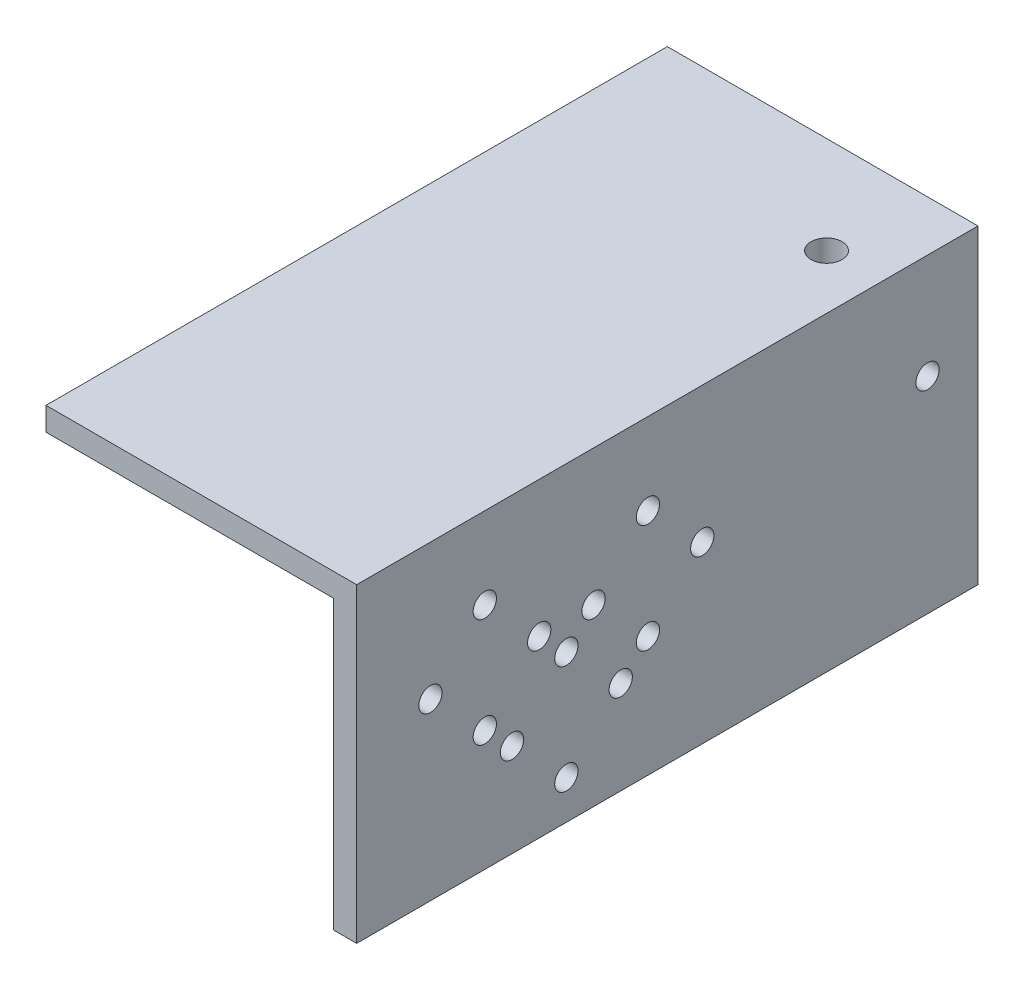
ISO-10303-21;
HEADER;
FILE_DESCRIPTION(('STEP AP214'),'2;1');
FILE_NAME('part.step','',(''),(''),'','','');
FILE_SCHEMA(('AUTOMOTIVE_DESIGN { 1 0 10303 214 1 1 1 1 }'));
ENDSEC;
DATA;
#1=APPLICATION_CONTEXT('core data for automotive mechanical design processes');
#2=APPLICATION_PROTOCOL_DEFINITION('international standard','automotive_design',2000,#1);
#3=PRODUCT_CONTEXT('',#1,'mechanical');
#4=PRODUCT('Part','Part','',(#3));
#5=PRODUCT_RELATED_PRODUCT_CATEGORY('part','',(#4));
#6=PRODUCT_DEFINITION_FORMATION('','',#4);
#7=PRODUCT_DEFINITION_CONTEXT('part definition',#1,'design');
#8=PRODUCT_DEFINITION('design','',#6,#7);
#9=PRODUCT_DEFINITION_SHAPE('','',#8);
#10=(LENGTH_UNIT() NAMED_UNIT(*) SI_UNIT(.MILLI.,.METRE.));
#11=(NAMED_UNIT(*) PLANE_ANGLE_UNIT() SI_UNIT($,.RADIAN.));
#12=(NAMED_UNIT(*) SI_UNIT($,.STERADIAN.) SOLID_ANGLE_UNIT());
#13=UNCERTAINTY_MEASURE_WITH_UNIT(LENGTH_MEASURE(1.E-05),#10,'distance_accuracy_value','');
#14=(GEOMETRIC_REPRESENTATION_CONTEXT(3) GLOBAL_UNCERTAINTY_ASSIGNED_CONTEXT((#13)) GLOBAL_UNIT_ASSIGNED_CONTEXT((#10,
#11,#12)) REPRESENTATION_CONTEXT('',''));
#15=CARTESIAN_POINT('',(0.,0.,0.));
#16=DIRECTION('',(0.,0.,1.));
#17=DIRECTION('',(1.,0.,0.));
#18=AXIS2_PLACEMENT_3D('',#15,#16,#17);
#19=CARTESIAN_POINT('',(0.,0.,-80.));
#20=DIRECTION('',(-1.,0.,0.));
#21=DIRECTION('',(0.,-1.,0.));
#22=AXIS2_PLACEMENT_3D('',#19,#20,#21);
#23=PLANE('',#22);
#24=DIRECTION('',(0.,-1.,0.));
#25=VECTOR('',#24,1.);
#26=CARTESIAN_POINT('',(0.,0.,-80.));
#27=LINE('',#26,#25);
#28=CARTESIAN_POINT('',(0.,0.,-80.));
#29=VERTEX_POINT('',#28);
#30=CARTESIAN_POINT('',(0.,-3.,-80.));
#31=VERTEX_POINT('',#30);
#32=EDGE_CURVE('E109',#29,#31,#27,.T.);
#33=ORIENTED_EDGE('',*,*,#32,.T.);
#34=DIRECTION('',(0.,0.,1.));
#35=VECTOR('',#34,1.);
#36=CARTESIAN_POINT('',(0.,-3.,-80.));
#37=LINE('',#36,#35);
#38=CARTESIAN_POINT('',(0.,-3.,0.));
#39=VERTEX_POINT('',#38);
#40=EDGE_CURVE('E100',#31,#39,#37,.T.);
#41=ORIENTED_EDGE('',*,*,#40,.T.);
#42=DIRECTION('',(0.,-1.,0.));
#43=VECTOR('',#42,1.);
#44=CARTESIAN_POINT('',(0.,0.,0.));
#45=LINE('',#44,#43);
#46=CARTESIAN_POINT('',(0.,0.,0.));
#47=VERTEX_POINT('',#46);
#48=EDGE_CURVE('E107',#47,#39,#45,.T.);
#49=ORIENTED_EDGE('',*,*,#48,.F.);
#50=DIRECTION('',(0.,0.,1.));
#51=VECTOR('',#50,1.);
#52=CARTESIAN_POINT('',(0.,0.,-80.));
#53=LINE('',#52,#51);
#54=EDGE_CURVE('E11',#29,#47,#53,.T.);
#55=ORIENTED_EDGE('',*,*,#54,.F.);
#56=EDGE_LOOP('',(#33,#41,#49,#55));
#57=FACE_BOUND('',#56,.T.);
#58=ADVANCED_FACE('F35',(#57),#23,.T.);
#59=CARTESIAN_POINT('',(0.,0.,-80.));
#60=DIRECTION('',(0.,1.,0.));
#61=DIRECTION('',(0.,0.,1.));
#62=AXIS2_PLACEMENT_3D('',#59,#60,#61);
#63=PLANE('',#62);
#64=CARTESIAN_POINT('',(33.,0.,-67.5));
#65=DIRECTION('',(0.,1.,0.));
#66=DIRECTION('',(0.,0.,1.));
#67=AXIS2_PLACEMENT_3D('',#64,#65,#66);
#68=CIRCLE('',#67,2.);
#69=CARTESIAN_POINT('',(33.,0.,-65.5));
#70=VERTEX_POINT('',#69);
#71=EDGE_CURVE('E186',#70,#70,#68,.T.);
#72=ORIENTED_EDGE('',*,*,#71,.F.);
#73=EDGE_LOOP('',(#72));
#74=FACE_BOUND('',#73,.T.);
#75=DIRECTION('',(-1.,0.,0.));
#76=VECTOR('',#75,1.);
#77=CARTESIAN_POINT('',(0.,0.,0.));
#78=LINE('',#77,#76);
#79=CARTESIAN_POINT('',(40.,0.,0.));
#80=VERTEX_POINT('',#79);
#81=EDGE_CURVE('E113',#80,#47,#78,.T.);
#82=ORIENTED_EDGE('',*,*,#81,.F.);
#83=DIRECTION('',(0.,0.,1.));
#84=VECTOR('',#83,1.);
#85=CARTESIAN_POINT('',(40.,0.,-80.));
#86=LINE('',#85,#84);
#87=CARTESIAN_POINT('',(40.,0.,-80.));
#88=VERTEX_POINT('',#87);
#89=EDGE_CURVE('E43',#88,#80,#86,.T.);
#90=ORIENTED_EDGE('',*,*,#89,.F.);
#91=DIRECTION('',(-1.,0.,0.));
#92=VECTOR('',#91,1.);
#93=CARTESIAN_POINT('',(0.,0.,-80.));
#94=LINE('',#93,#92);
#95=EDGE_CURVE('E119',#88,#29,#94,.T.);
#96=ORIENTED_EDGE('',*,*,#95,.T.);
#97=ORIENTED_EDGE('',*,*,#54,.T.);
#98=EDGE_LOOP('',(#82,#90,#96,#97));
#99=FACE_BOUND('',#98,.T.);
#100=ADVANCED_FACE('F225',(#74,#99),#63,.T.);
#101=CARTESIAN_POINT('',(40.,0.,-80.));
#102=DIRECTION('',(1.,0.,0.));
#103=DIRECTION('',(0.,1.,0.));
#104=AXIS2_PLACEMENT_3D('',#101,#102,#103);
#105=PLANE('',#104);
#106=CARTESIAN_POINT('',(40.,-10.5,-37.5));
#107=DIRECTION('',(1.,0.,0.));
#108=DIRECTION('',(0.,-1.,0.));
#109=AXIS2_PLACEMENT_3D('',#106,#107,#108);
#110=CIRCLE('',#109,1.5);
#111=CARTESIAN_POINT('',(40.,-12.,-37.5));
#112=VERTEX_POINT('',#111);
#113=EDGE_CURVE('E176',#112,#112,#110,.T.);
#114=ORIENTED_EDGE('',*,*,#113,.F.);
#115=EDGE_LOOP('',(#114));
#116=FACE_BOUND('',#115,.T.);
#117=CARTESIAN_POINT('',(40.,-17.5,-30.5));
#118=DIRECTION('',(1.,0.,0.));
#119=DIRECTION('',(0.,-1.,0.));
#120=AXIS2_PLACEMENT_3D('',#117,#118,#119);
#121=CIRCLE('',#120,1.5);
#122=CARTESIAN_POINT('',(40.,-19.,-30.5));
#123=VERTEX_POINT('',#122);
#124=EDGE_CURVE('E173',#123,#123,#121,.T.);
#125=ORIENTED_EDGE('',*,*,#124,.F.);
#126=EDGE_LOOP('',(#125));
#127=FACE_BOUND('',#126,.T.);
#128=CARTESIAN_POINT('',(40.,-24.5,-37.5));
#129=DIRECTION('',(1.,0.,0.));
#130=DIRECTION('',(0.,-1.,0.));
#131=AXIS2_PLACEMENT_3D('',#128,#129,#130);
#132=CIRCLE('',#131,1.5);
#133=CARTESIAN_POINT('',(40.,-26.,-37.5));
#134=VERTEX_POINT('',#133);
#135=EDGE_CURVE('E170',#134,#134,#132,.T.);
#136=ORIENTED_EDGE('',*,*,#135,.F.);
#137=EDGE_LOOP('',(#136));
#138=FACE_BOUND('',#137,.T.);
#139=CARTESIAN_POINT('',(40.,-17.5,-9.5));
#140=DIRECTION('',(1.,0.,0.));
#141=DIRECTION('',(0.,1.,0.));
#142=AXIS2_PLACEMENT_3D('',#139,#140,#141);
#143=CIRCLE('',#142,1.5);
#144=CARTESIAN_POINT('',(40.,-16.,-9.5));
#145=VERTEX_POINT('',#144);
#146=EDGE_CURVE('E166',#145,#145,#143,.T.);
#147=ORIENTED_EDGE('',*,*,#146,.F.);
#148=EDGE_LOOP('',(#147));
#149=FACE_BOUND('',#148,.T.);
#150=CARTESIAN_POINT('',(40.,-24.5,-16.5));
#151=DIRECTION('',(1.,0.,0.));
#152=DIRECTION('',(0.,1.,0.));
#153=AXIS2_PLACEMENT_3D('',#150,#151,#152);
#154=CIRCLE('',#153,1.5);
#155=CARTESIAN_POINT('',(40.,-23.,-16.5));
#156=VERTEX_POINT('',#155);
#157=EDGE_CURVE('E162',#156,#156,#154,.T.);
#158=ORIENTED_EDGE('',*,*,#157,.F.);
#159=EDGE_LOOP('',(#158));
#160=FACE_BOUND('',#159,.T.);
#161=CARTESIAN_POINT('',(40.,-17.5,-23.5));
#162=DIRECTION('',(1.,0.,0.));
#163=DIRECTION('',(0.,1.,0.));
#164=AXIS2_PLACEMENT_3D('',#161,#162,#163);
#165=CIRCLE('',#164,1.5);
#166=CARTESIAN_POINT('',(40.,-16.,-23.5));
#167=VERTEX_POINT('',#166);
#168=EDGE_CURVE('E158',#167,#167,#165,.T.);
#169=ORIENTED_EDGE('',*,*,#168,.F.);
#170=EDGE_LOOP('',(#169));
#171=FACE_BOUND('',#170,.T.);
#172=CARTESIAN_POINT('',(40.,-10.5,-16.5));
#173=DIRECTION('',(1.,0.,0.));
#174=DIRECTION('',(0.,1.,0.));
#175=AXIS2_PLACEMENT_3D('',#172,#173,#174);
#176=CIRCLE('',#175,1.5);
#177=CARTESIAN_POINT('',(40.,-9.,-16.5));
#178=VERTEX_POINT('',#177);
#179=EDGE_CURVE('E154',#178,#178,#176,.T.);
#180=ORIENTED_EDGE('',*,*,#179,.F.);
#181=EDGE_LOOP('',(#180));
#182=FACE_BOUND('',#181,.T.);
#183=CARTESIAN_POINT('',(40.,-28.,-20.));
#184=DIRECTION('',(1.,0.,0.));
#185=DIRECTION('',(0.,1.,0.));
#186=AXIS2_PLACEMENT_3D('',#183,#184,#185);
#187=CIRCLE('',#186,1.5);
#188=CARTESIAN_POINT('',(40.,-26.5,-20.));
#189=VERTEX_POINT('',#188);
#190=EDGE_CURVE('E150',#189,#189,#187,.T.);
#191=ORIENTED_EDGE('',*,*,#190,.F.);
#192=EDGE_LOOP('',(#191));
#193=FACE_BOUND('',#192,.T.);
#194=CARTESIAN_POINT('',(40.,-35.,-27.));
#195=DIRECTION('',(1.,0.,0.));
#196=DIRECTION('',(0.,1.,0.));
#197=AXIS2_PLACEMENT_3D('',#194,#195,#196);
#198=CIRCLE('',#197,1.5);
#199=CARTESIAN_POINT('',(40.,-33.5,-27.));
#200=VERTEX_POINT('',#199);
#201=EDGE_CURVE('E146',#200,#200,#198,.T.);
#202=ORIENTED_EDGE('',*,*,#201,.F.);
#203=EDGE_LOOP('',(#202));
#204=FACE_BOUND('',#203,.T.);
#205=CARTESIAN_POINT('',(40.,-28.,-34.));
#206=DIRECTION('',(1.,0.,0.));
#207=DIRECTION('',(0.,1.,0.));
#208=AXIS2_PLACEMENT_3D('',#205,#206,#207);
#209=CIRCLE('',#208,1.5);
#210=CARTESIAN_POINT('',(40.,-26.5,-34.));
#211=VERTEX_POINT('',#210);
#212=EDGE_CURVE('E142',#211,#211,#209,.T.);
#213=ORIENTED_EDGE('',*,*,#212,.F.);
#214=EDGE_LOOP('',(#213));
#215=FACE_BOUND('',#214,.T.);
#216=CARTESIAN_POINT('',(40.,-21.,-27.));
#217=DIRECTION('',(1.,0.,0.));
#218=DIRECTION('',(0.,1.,0.));
#219=AXIS2_PLACEMENT_3D('',#216,#217,#218);
#220=CIRCLE('',#219,1.5);
#221=CARTESIAN_POINT('',(40.,-19.5,-27.));
#222=VERTEX_POINT('',#221);
#223=EDGE_CURVE('E138',#222,#222,#220,.T.);
#224=ORIENTED_EDGE('',*,*,#223,.F.);
#225=EDGE_LOOP('',(#224));
#226=FACE_BOUND('',#225,.T.);
#227=CARTESIAN_POINT('',(40.,-13.5,-73.5));
#228=DIRECTION('',(1.,0.,0.));
#229=DIRECTION('',(0.,1.,0.));
#230=AXIS2_PLACEMENT_3D('',#227,#228,#229);
#231=CIRCLE('',#230,1.5);
#232=CARTESIAN_POINT('',(40.,-12.,-73.5));
#233=VERTEX_POINT('',#232);
#234=EDGE_CURVE('E134',#233,#233,#231,.T.);
#235=ORIENTED_EDGE('',*,*,#234,.F.);
#236=EDGE_LOOP('',(#235));
#237=FACE_BOUND('',#236,.T.);
#238=CARTESIAN_POINT('',(40.,-17.5,-44.5));
#239=DIRECTION('',(1.,0.,0.));
#240=DIRECTION('',(0.,-1.,0.));
#241=AXIS2_PLACEMENT_3D('',#238,#239,#240);
#242=CIRCLE('',#241,1.5);
#243=CARTESIAN_POINT('',(40.,-19.,-44.5));
#244=VERTEX_POINT('',#243);
#245=EDGE_CURVE('E130',#244,#244,#242,.T.);
#246=ORIENTED_EDGE('',*,*,#245,.F.);
#247=EDGE_LOOP('',(#246));
#248=FACE_BOUND('',#247,.T.);
#249=DIRECTION('',(0.,1.,0.));
#250=VECTOR('',#249,1.);
#251=CARTESIAN_POINT('',(40.,0.,0.));
#252=LINE('',#251,#250);
#253=CARTESIAN_POINT('',(40.,-40.,0.));
#254=VERTEX_POINT('',#253);
#255=EDGE_CURVE('E116',#254,#80,#252,.T.);
#256=ORIENTED_EDGE('',*,*,#255,.F.);
#257=DIRECTION('',(0.,0.,1.));
#258=VECTOR('',#257,1.);
#259=CARTESIAN_POINT('',(40.,-40.,-80.));
#260=LINE('',#259,#258);
#261=CARTESIAN_POINT('',(40.,-40.,-80.));
#262=VERTEX_POINT('',#261);
#263=EDGE_CURVE('E125',#262,#254,#260,.T.);
#264=ORIENTED_EDGE('',*,*,#263,.F.);
#265=DIRECTION('',(0.,1.,0.));
#266=VECTOR('',#265,1.);
#267=CARTESIAN_POINT('',(40.,0.,-80.));
#268=LINE('',#267,#266);
#269=EDGE_CURVE('E220',#262,#88,#268,.T.);
#270=ORIENTED_EDGE('',*,*,#269,.T.);
#271=ORIENTED_EDGE('',*,*,#89,.T.);
#272=EDGE_LOOP('',(#256,#264,#270,#271));
#273=FACE_BOUND('',#272,.T.);
#274=ADVANCED_FACE('F232',(#116,#127,#138,#149,#160,#171,#182,#193,#204,#215,#226,#237,#248,
#273),#105,.T.);
#275=CARTESIAN_POINT('',(0.,-40.,-80.));
#276=DIRECTION('',(0.,-1.,0.));
#277=DIRECTION('',(0.,0.,-1.));
#278=AXIS2_PLACEMENT_3D('',#275,#276,#277);
#279=PLANE('',#278);
#280=DIRECTION('',(0.,0.,1.));
#281=VECTOR('',#280,1.);
#282=CARTESIAN_POINT('',(37.,-40.,-80.));
#283=LINE('',#282,#281);
#284=CARTESIAN_POINT('',(37.,-40.,-80.));
#285=VERTEX_POINT('',#284);
#286=CARTESIAN_POINT('',(37.,-40.,0.));
#287=VERTEX_POINT('',#286);
#288=EDGE_CURVE('E211',#285,#287,#283,.T.);
#289=ORIENTED_EDGE('',*,*,#288,.F.);
#290=DIRECTION('',(1.,0.,0.));
#291=VECTOR('',#290,1.);
#292=CARTESIAN_POINT('',(0.,-40.,-80.));
#293=LINE('',#292,#291);
#294=EDGE_CURVE('E80',#285,#262,#293,.T.);
#295=ORIENTED_EDGE('',*,*,#294,.T.);
#296=ORIENTED_EDGE('',*,*,#263,.T.);
#297=DIRECTION('',(1.,0.,0.));
#298=VECTOR('',#297,1.);
#299=CARTESIAN_POINT('',(0.,-40.,0.));
#300=LINE('',#299,#298);
#301=EDGE_CURVE('E114',#287,#254,#300,.T.);
#302=ORIENTED_EDGE('',*,*,#301,.F.);
#303=EDGE_LOOP('',(#289,#295,#296,#302));
#304=FACE_BOUND('',#303,.T.);
#305=ADVANCED_FACE('F230',(#304),#279,.T.);
#306=CARTESIAN_POINT('',(0.,0.,-80.));
#307=DIRECTION('',(0.,0.,1.));
#308=DIRECTION('',(1.,0.,0.));
#309=AXIS2_PLACEMENT_3D('',#306,#307,#308);
#310=PLANE('',#309);
#311=DIRECTION('',(0.,1.,0.));
#312=VECTOR('',#311,1.);
#313=CARTESIAN_POINT('',(37.,0.,-80.));
#314=LINE('',#313,#312);
#315=CARTESIAN_POINT('',(37.,-3.,-80.));
#316=VERTEX_POINT('',#315);
#317=EDGE_CURVE('E105',#285,#316,#314,.T.);
#318=ORIENTED_EDGE('',*,*,#317,.T.);
#319=DIRECTION('',(-1.,0.,0.));
#320=VECTOR('',#319,1.);
#321=CARTESIAN_POINT('',(0.,-3.,-80.));
#322=LINE('',#321,#320);
#323=EDGE_CURVE('E213',#316,#31,#322,.T.);
#324=ORIENTED_EDGE('',*,*,#323,.T.);
#325=ORIENTED_EDGE('',*,*,#32,.F.);
#326=ORIENTED_EDGE('',*,*,#95,.F.);
#327=ORIENTED_EDGE('',*,*,#269,.F.);
#328=ORIENTED_EDGE('',*,*,#294,.F.);
#329=EDGE_LOOP('',(#318,#324,#325,#326,#327,#328));
#330=FACE_BOUND('',#329,.T.);
#331=ADVANCED_FACE('F227',(#330),#310,.F.);
#332=CARTESIAN_POINT('',(0.,0.,0.));
#333=DIRECTION('',(0.,0.,1.));
#334=DIRECTION('',(1.,0.,0.));
#335=AXIS2_PLACEMENT_3D('',#332,#333,#334);
#336=PLANE('',#335);
#337=DIRECTION('',(0.,1.,0.));
#338=VECTOR('',#337,1.);
#339=CARTESIAN_POINT('',(37.,0.,0.));
#340=LINE('',#339,#338);
#341=CARTESIAN_POINT('',(37.,-3.,0.));
#342=VERTEX_POINT('',#341);
#343=EDGE_CURVE('E51',#287,#342,#340,.T.);
#344=ORIENTED_EDGE('',*,*,#343,.F.);
#345=ORIENTED_EDGE('',*,*,#301,.T.);
#346=ORIENTED_EDGE('',*,*,#255,.T.);
#347=ORIENTED_EDGE('',*,*,#81,.T.);
#348=ORIENTED_EDGE('',*,*,#48,.T.);
#349=DIRECTION('',(-1.,0.,0.));
#350=VECTOR('',#349,1.);
#351=CARTESIAN_POINT('',(0.,-3.,0.));
#352=LINE('',#351,#350);
#353=EDGE_CURVE('E96',#342,#39,#352,.T.);
#354=ORIENTED_EDGE('',*,*,#353,.F.);
#355=EDGE_LOOP('',(#344,#345,#346,#347,#348,#354));
#356=FACE_BOUND('',#355,.T.);
#357=ADVANCED_FACE('F111',(#356),#336,.T.);
#358=CARTESIAN_POINT('',(0.,-3.,-80.));
#359=DIRECTION('',(0.,1.,0.));
#360=DIRECTION('',(0.,0.,1.));
#361=AXIS2_PLACEMENT_3D('',#358,#359,#360);
#362=PLANE('',#361);
#363=CARTESIAN_POINT('',(33.,-3.,-67.5));
#364=DIRECTION('',(0.,1.,0.));
#365=DIRECTION('',(0.,0.,1.));
#366=AXIS2_PLACEMENT_3D('',#363,#364,#365);
#367=CIRCLE('',#366,2.);
#368=CARTESIAN_POINT('',(33.,-3.,-65.5));
#369=VERTEX_POINT('',#368);
#370=EDGE_CURVE('E38',#369,#369,#367,.T.);
#371=ORIENTED_EDGE('',*,*,#370,.T.);
#372=EDGE_LOOP('',(#371));
#373=FACE_BOUND('',#372,.T.);
#374=ORIENTED_EDGE('',*,*,#353,.T.);
#375=ORIENTED_EDGE('',*,*,#40,.F.);
#376=ORIENTED_EDGE('',*,*,#323,.F.);
#377=DIRECTION('',(0.,0.,1.));
#378=VECTOR('',#377,1.);
#379=CARTESIAN_POINT('',(37.,-3.,-80.));
#380=LINE('',#379,#378);
#381=EDGE_CURVE('E102',#316,#342,#380,.T.);
#382=ORIENTED_EDGE('',*,*,#381,.T.);
#383=EDGE_LOOP('',(#374,#375,#376,#382));
#384=FACE_BOUND('',#383,.T.);
#385=ADVANCED_FACE('F98',(#373,#384),#362,.F.);
#386=CARTESIAN_POINT('',(37.,0.,-80.));
#387=DIRECTION('',(1.,0.,0.));
#388=DIRECTION('',(0.,1.,0.));
#389=AXIS2_PLACEMENT_3D('',#386,#387,#388);
#390=PLANE('',#389);
#391=CARTESIAN_POINT('',(37.,-10.5,-37.5));
#392=DIRECTION('',(1.,0.,0.));
#393=DIRECTION('',(0.,1.,0.));
#394=AXIS2_PLACEMENT_3D('',#391,#392,#393);
#395=CIRCLE('',#394,1.5);
#396=CARTESIAN_POINT('',(37.,-8.99999999999999,-37.5));
#397=VERTEX_POINT('',#396);
#398=EDGE_CURVE('E174',#397,#397,#395,.T.);
#399=ORIENTED_EDGE('',*,*,#398,.T.);
#400=EDGE_LOOP('',(#399));
#401=FACE_BOUND('',#400,.T.);
#402=CARTESIAN_POINT('',(37.,-17.5,-30.5));
#403=DIRECTION('',(1.,0.,0.));
#404=DIRECTION('',(0.,1.,0.));
#405=AXIS2_PLACEMENT_3D('',#402,#403,#404);
#406=CIRCLE('',#405,1.5);
#407=CARTESIAN_POINT('',(37.,-16.,-30.5));
#408=VERTEX_POINT('',#407);
#409=EDGE_CURVE('E171',#408,#408,#406,.T.);
#410=ORIENTED_EDGE('',*,*,#409,.T.);
#411=EDGE_LOOP('',(#410));
#412=FACE_BOUND('',#411,.T.);
#413=CARTESIAN_POINT('',(37.,-24.5,-37.5));
#414=DIRECTION('',(1.,0.,0.));
#415=DIRECTION('',(0.,1.,0.));
#416=AXIS2_PLACEMENT_3D('',#413,#414,#415);
#417=CIRCLE('',#416,1.5);
#418=CARTESIAN_POINT('',(37.,-23.,-37.5));
#419=VERTEX_POINT('',#418);
#420=EDGE_CURVE('E167',#419,#419,#417,.T.);
#421=ORIENTED_EDGE('',*,*,#420,.T.);
#422=EDGE_LOOP('',(#421));
#423=FACE_BOUND('',#422,.T.);
#424=CARTESIAN_POINT('',(37.,-17.5,-9.5));
#425=DIRECTION('',(1.,0.,0.));
#426=DIRECTION('',(0.,1.,0.));
#427=AXIS2_PLACEMENT_3D('',#424,#425,#426);
#428=CIRCLE('',#427,1.5);
#429=CARTESIAN_POINT('',(37.,-16.,-9.5));
#430=VERTEX_POINT('',#429);
#431=EDGE_CURVE('E163',#430,#430,#428,.T.);
#432=ORIENTED_EDGE('',*,*,#431,.T.);
#433=EDGE_LOOP('',(#432));
#434=FACE_BOUND('',#433,.T.);
#435=CARTESIAN_POINT('',(37.,-24.5,-16.5));
#436=DIRECTION('',(1.,0.,0.));
#437=DIRECTION('',(0.,1.,0.));
#438=AXIS2_PLACEMENT_3D('',#435,#436,#437);
#439=CIRCLE('',#438,1.5);
#440=CARTESIAN_POINT('',(37.,-23.,-16.5));
#441=VERTEX_POINT('',#440);
#442=EDGE_CURVE('E159',#441,#441,#439,.T.);
#443=ORIENTED_EDGE('',*,*,#442,.T.);
#444=EDGE_LOOP('',(#443));
#445=FACE_BOUND('',#444,.T.);
#446=CARTESIAN_POINT('',(37.,-17.5,-23.5));
#447=DIRECTION('',(1.,0.,0.));
#448=DIRECTION('',(0.,1.,0.));
#449=AXIS2_PLACEMENT_3D('',#446,#447,#448);
#450=CIRCLE('',#449,1.5);
#451=CARTESIAN_POINT('',(37.,-16.,-23.5));
#452=VERTEX_POINT('',#451);
#453=EDGE_CURVE('E155',#452,#452,#450,.T.);
#454=ORIENTED_EDGE('',*,*,#453,.T.);
#455=EDGE_LOOP('',(#454));
#456=FACE_BOUND('',#455,.T.);
#457=CARTESIAN_POINT('',(37.,-10.5,-16.5));
#458=DIRECTION('',(1.,0.,0.));
#459=DIRECTION('',(0.,1.,0.));
#460=AXIS2_PLACEMENT_3D('',#457,#458,#459);
#461=CIRCLE('',#460,1.5);
#462=CARTESIAN_POINT('',(37.,-9.,-16.5));
#463=VERTEX_POINT('',#462);
#464=EDGE_CURVE('E151',#463,#463,#461,.T.);
#465=ORIENTED_EDGE('',*,*,#464,.T.);
#466=EDGE_LOOP('',(#465));
#467=FACE_BOUND('',#466,.T.);
#468=CARTESIAN_POINT('',(37.,-28.,-20.));
#469=DIRECTION('',(1.,0.,0.));
#470=DIRECTION('',(0.,1.,0.));
#471=AXIS2_PLACEMENT_3D('',#468,#469,#470);
#472=CIRCLE('',#471,1.5);
#473=CARTESIAN_POINT('',(37.,-26.5,-20.));
#474=VERTEX_POINT('',#473);
#475=EDGE_CURVE('E147',#474,#474,#472,.T.);
#476=ORIENTED_EDGE('',*,*,#475,.T.);
#477=EDGE_LOOP('',(#476));
#478=FACE_BOUND('',#477,.T.);
#479=CARTESIAN_POINT('',(37.,-35.,-27.));
#480=DIRECTION('',(1.,0.,0.));
#481=DIRECTION('',(0.,1.,0.));
#482=AXIS2_PLACEMENT_3D('',#479,#480,#481);
#483=CIRCLE('',#482,1.5);
#484=CARTESIAN_POINT('',(37.,-33.5,-27.));
#485=VERTEX_POINT('',#484);
#486=EDGE_CURVE('E143',#485,#485,#483,.T.);
#487=ORIENTED_EDGE('',*,*,#486,.T.);
#488=EDGE_LOOP('',(#487));
#489=FACE_BOUND('',#488,.T.);
#490=CARTESIAN_POINT('',(37.,-28.,-34.));
#491=DIRECTION('',(1.,0.,0.));
#492=DIRECTION('',(0.,1.,0.));
#493=AXIS2_PLACEMENT_3D('',#490,#491,#492);
#494=CIRCLE('',#493,1.5);
#495=CARTESIAN_POINT('',(37.,-26.5,-34.));
#496=VERTEX_POINT('',#495);
#497=EDGE_CURVE('E139',#496,#496,#494,.T.);
#498=ORIENTED_EDGE('',*,*,#497,.T.);
#499=EDGE_LOOP('',(#498));
#500=FACE_BOUND('',#499,.T.);
#501=CARTESIAN_POINT('',(37.,-21.,-27.));
#502=DIRECTION('',(1.,0.,0.));
#503=DIRECTION('',(0.,1.,0.));
#504=AXIS2_PLACEMENT_3D('',#501,#502,#503);
#505=CIRCLE('',#504,1.5);
#506=CARTESIAN_POINT('',(37.,-19.5,-27.));
#507=VERTEX_POINT('',#506);
#508=EDGE_CURVE('E135',#507,#507,#505,.T.);
#509=ORIENTED_EDGE('',*,*,#508,.T.);
#510=EDGE_LOOP('',(#509));
#511=FACE_BOUND('',#510,.T.);
#512=CARTESIAN_POINT('',(37.,-13.5,-73.5));
#513=DIRECTION('',(1.,0.,0.));
#514=DIRECTION('',(0.,1.,0.));
#515=AXIS2_PLACEMENT_3D('',#512,#513,#514);
#516=CIRCLE('',#515,1.5);
#517=CARTESIAN_POINT('',(37.,-12.,-73.5));
#518=VERTEX_POINT('',#517);
#519=EDGE_CURVE('E131',#518,#518,#516,.T.);
#520=ORIENTED_EDGE('',*,*,#519,.T.);
#521=EDGE_LOOP('',(#520));
#522=FACE_BOUND('',#521,.T.);
#523=CARTESIAN_POINT('',(37.,-17.5,-44.5));
#524=DIRECTION('',(1.,0.,0.));
#525=DIRECTION('',(0.,1.,0.));
#526=AXIS2_PLACEMENT_3D('',#523,#524,#525);
#527=CIRCLE('',#526,1.5);
#528=CARTESIAN_POINT('',(37.,-16.,-44.5));
#529=VERTEX_POINT('',#528);
#530=EDGE_CURVE('E127',#529,#529,#527,.T.);
#531=ORIENTED_EDGE('',*,*,#530,.T.);
#532=EDGE_LOOP('',(#531));
#533=FACE_BOUND('',#532,.T.);
#534=ORIENTED_EDGE('',*,*,#343,.T.);
#535=ORIENTED_EDGE('',*,*,#381,.F.);
#536=ORIENTED_EDGE('',*,*,#317,.F.);
#537=ORIENTED_EDGE('',*,*,#288,.T.);
#538=EDGE_LOOP('',(#534,#535,#536,#537));
#539=FACE_BOUND('',#538,.T.);
#540=ADVANCED_FACE('F228',(#401,#412,#423,#434,#445,#456,#467,#478,#489,#500,#511,#522,#533,
#539),#390,.F.);
#541=CARTESIAN_POINT('',(0.,-17.5,-44.5));
#542=DIRECTION('',(1.,0.,0.));
#543=DIRECTION('',(0.,1.,0.));
#544=AXIS2_PLACEMENT_3D('',#541,#542,#543);
#545=CYLINDRICAL_SURFACE('',#544,1.5);
#546=ORIENTED_EDGE('',*,*,#245,.T.);
#547=EDGE_LOOP('',(#546));
#548=FACE_BOUND('',#547,.T.);
#549=ORIENTED_EDGE('',*,*,#530,.F.);
#550=EDGE_LOOP('',(#549));
#551=FACE_BOUND('',#550,.T.);
#552=ADVANCED_FACE('F370',(#548,#551),#545,.F.);
#553=CARTESIAN_POINT('',(0.,-13.5,-73.5));
#554=DIRECTION('',(1.,0.,0.));
#555=DIRECTION('',(0.,1.,0.));
#556=AXIS2_PLACEMENT_3D('',#553,#554,#555);
#557=CYLINDRICAL_SURFACE('',#556,1.5);
#558=ORIENTED_EDGE('',*,*,#234,.T.);
#559=EDGE_LOOP('',(#558));
#560=FACE_BOUND('',#559,.T.);
#561=ORIENTED_EDGE('',*,*,#519,.F.);
#562=EDGE_LOOP('',(#561));
#563=FACE_BOUND('',#562,.T.);
#564=ADVANCED_FACE('F362',(#560,#563),#557,.F.);
#565=CARTESIAN_POINT('',(0.,-21.,-27.));
#566=DIRECTION('',(1.,0.,0.));
#567=DIRECTION('',(0.,1.,0.));
#568=AXIS2_PLACEMENT_3D('',#565,#566,#567);
#569=CYLINDRICAL_SURFACE('',#568,1.5);
#570=ORIENTED_EDGE('',*,*,#223,.T.);
#571=EDGE_LOOP('',(#570));
#572=FACE_BOUND('',#571,.T.);
#573=ORIENTED_EDGE('',*,*,#508,.F.);
#574=EDGE_LOOP('',(#573));
#575=FACE_BOUND('',#574,.T.);
#576=ADVANCED_FACE('F354',(#572,#575),#569,.F.);
#577=CARTESIAN_POINT('',(0.,-28.,-34.));
#578=DIRECTION('',(1.,0.,0.));
#579=DIRECTION('',(0.,1.,0.));
#580=AXIS2_PLACEMENT_3D('',#577,#578,#579);
#581=CYLINDRICAL_SURFACE('',#580,1.5);
#582=ORIENTED_EDGE('',*,*,#212,.T.);
#583=EDGE_LOOP('',(#582));
#584=FACE_BOUND('',#583,.T.);
#585=ORIENTED_EDGE('',*,*,#497,.F.);
#586=EDGE_LOOP('',(#585));
#587=FACE_BOUND('',#586,.T.);
#588=ADVANCED_FACE('F346',(#584,#587),#581,.F.);
#589=CARTESIAN_POINT('',(0.,-35.,-27.));
#590=DIRECTION('',(1.,0.,0.));
#591=DIRECTION('',(0.,1.,0.));
#592=AXIS2_PLACEMENT_3D('',#589,#590,#591);
#593=CYLINDRICAL_SURFACE('',#592,1.5);
#594=ORIENTED_EDGE('',*,*,#201,.T.);
#595=EDGE_LOOP('',(#594));
#596=FACE_BOUND('',#595,.T.);
#597=ORIENTED_EDGE('',*,*,#486,.F.);
#598=EDGE_LOOP('',(#597));
#599=FACE_BOUND('',#598,.T.);
#600=ADVANCED_FACE('F338',(#596,#599),#593,.F.);
#601=CARTESIAN_POINT('',(0.,-28.,-20.));
#602=DIRECTION('',(1.,0.,0.));
#603=DIRECTION('',(0.,1.,0.));
#604=AXIS2_PLACEMENT_3D('',#601,#602,#603);
#605=CYLINDRICAL_SURFACE('',#604,1.5);
#606=ORIENTED_EDGE('',*,*,#190,.T.);
#607=EDGE_LOOP('',(#606));
#608=FACE_BOUND('',#607,.T.);
#609=ORIENTED_EDGE('',*,*,#475,.F.);
#610=EDGE_LOOP('',(#609));
#611=FACE_BOUND('',#610,.T.);
#612=ADVANCED_FACE('F330',(#608,#611),#605,.F.);
#613=CARTESIAN_POINT('',(0.,-10.5,-16.5));
#614=DIRECTION('',(1.,0.,0.));
#615=DIRECTION('',(0.,1.,0.));
#616=AXIS2_PLACEMENT_3D('',#613,#614,#615);
#617=CYLINDRICAL_SURFACE('',#616,1.5);
#618=ORIENTED_EDGE('',*,*,#179,.T.);
#619=EDGE_LOOP('',(#618));
#620=FACE_BOUND('',#619,.T.);
#621=ORIENTED_EDGE('',*,*,#464,.F.);
#622=EDGE_LOOP('',(#621));
#623=FACE_BOUND('',#622,.T.);
#624=ADVANCED_FACE('F322',(#620,#623),#617,.F.);
#625=CARTESIAN_POINT('',(0.,-17.5,-23.5));
#626=DIRECTION('',(1.,0.,0.));
#627=DIRECTION('',(0.,1.,0.));
#628=AXIS2_PLACEMENT_3D('',#625,#626,#627);
#629=CYLINDRICAL_SURFACE('',#628,1.5);
#630=ORIENTED_EDGE('',*,*,#168,.T.);
#631=EDGE_LOOP('',(#630));
#632=FACE_BOUND('',#631,.T.);
#633=ORIENTED_EDGE('',*,*,#453,.F.);
#634=EDGE_LOOP('',(#633));
#635=FACE_BOUND('',#634,.T.);
#636=ADVANCED_FACE('F314',(#632,#635),#629,.F.);
#637=CARTESIAN_POINT('',(0.,-24.5,-16.5));
#638=DIRECTION('',(1.,0.,0.));
#639=DIRECTION('',(0.,1.,0.));
#640=AXIS2_PLACEMENT_3D('',#637,#638,#639);
#641=CYLINDRICAL_SURFACE('',#640,1.5);
#642=ORIENTED_EDGE('',*,*,#157,.T.);
#643=EDGE_LOOP('',(#642));
#644=FACE_BOUND('',#643,.T.);
#645=ORIENTED_EDGE('',*,*,#442,.F.);
#646=EDGE_LOOP('',(#645));
#647=FACE_BOUND('',#646,.T.);
#648=ADVANCED_FACE('F306',(#644,#647),#641,.F.);
#649=CARTESIAN_POINT('',(0.,-17.5,-9.5));
#650=DIRECTION('',(1.,0.,0.));
#651=DIRECTION('',(0.,1.,0.));
#652=AXIS2_PLACEMENT_3D('',#649,#650,#651);
#653=CYLINDRICAL_SURFACE('',#652,1.5);
#654=ORIENTED_EDGE('',*,*,#146,.T.);
#655=EDGE_LOOP('',(#654));
#656=FACE_BOUND('',#655,.T.);
#657=ORIENTED_EDGE('',*,*,#431,.F.);
#658=EDGE_LOOP('',(#657));
#659=FACE_BOUND('',#658,.T.);
#660=ADVANCED_FACE('F298',(#656,#659),#653,.F.);
#661=CARTESIAN_POINT('',(0.,-24.5,-37.5));
#662=DIRECTION('',(1.,0.,0.));
#663=DIRECTION('',(0.,1.,0.));
#664=AXIS2_PLACEMENT_3D('',#661,#662,#663);
#665=CYLINDRICAL_SURFACE('',#664,1.5);
#666=ORIENTED_EDGE('',*,*,#135,.T.);
#667=EDGE_LOOP('',(#666));
#668=FACE_BOUND('',#667,.T.);
#669=ORIENTED_EDGE('',*,*,#420,.F.);
#670=EDGE_LOOP('',(#669));
#671=FACE_BOUND('',#670,.T.);
#672=ADVANCED_FACE('F290',(#668,#671),#665,.F.);
#673=CARTESIAN_POINT('',(0.,-17.5,-30.5));
#674=DIRECTION('',(1.,0.,0.));
#675=DIRECTION('',(0.,1.,0.));
#676=AXIS2_PLACEMENT_3D('',#673,#674,#675);
#677=CYLINDRICAL_SURFACE('',#676,1.5);
#678=ORIENTED_EDGE('',*,*,#124,.T.);
#679=EDGE_LOOP('',(#678));
#680=FACE_BOUND('',#679,.T.);
#681=ORIENTED_EDGE('',*,*,#409,.F.);
#682=EDGE_LOOP('',(#681));
#683=FACE_BOUND('',#682,.T.);
#684=ADVANCED_FACE('F286',(#680,#683),#677,.F.);
#685=CARTESIAN_POINT('',(0.,-10.5,-37.5));
#686=DIRECTION('',(1.,0.,0.));
#687=DIRECTION('',(0.,1.,0.));
#688=AXIS2_PLACEMENT_3D('',#685,#686,#687);
#689=CYLINDRICAL_SURFACE('',#688,1.5);
#690=ORIENTED_EDGE('',*,*,#113,.T.);
#691=EDGE_LOOP('',(#690));
#692=FACE_BOUND('',#691,.T.);
#693=ORIENTED_EDGE('',*,*,#398,.F.);
#694=EDGE_LOOP('',(#693));
#695=FACE_BOUND('',#694,.T.);
#696=ADVANCED_FACE('F258',(#692,#695),#689,.F.);
#697=CARTESIAN_POINT('',(33.,-80.,-67.5));
#698=DIRECTION('',(0.,1.,0.));
#699=DIRECTION('',(0.,0.,1.));
#700=AXIS2_PLACEMENT_3D('',#697,#698,#699);
#701=CYLINDRICAL_SURFACE('',#700,2.);
#702=ORIENTED_EDGE('',*,*,#71,.T.);
#703=EDGE_LOOP('',(#702));
#704=FACE_BOUND('',#703,.T.);
#705=ORIENTED_EDGE('',*,*,#370,.F.);
#706=EDGE_LOOP('',(#705));
#707=FACE_BOUND('',#706,.T.);
#708=ADVANCED_FACE('F275',(#704,#707),#701,.F.);
#709=CLOSED_SHELL('',(#58,#100,#274,#305,#331,#357,#385,#540,#552,#564,#576,#588,#600,#612,#624,
#636,#648,#660,#672,#684,#696,#708));
#710=MANIFOLD_SOLID_BREP('B2',#709);
#711=ADVANCED_BREP_SHAPE_REPRESENTATION('',(#18,#710),#14);
#712=SHAPE_DEFINITION_REPRESENTATION(#9,#711);
ENDSEC;
END-ISO-10303-21;
